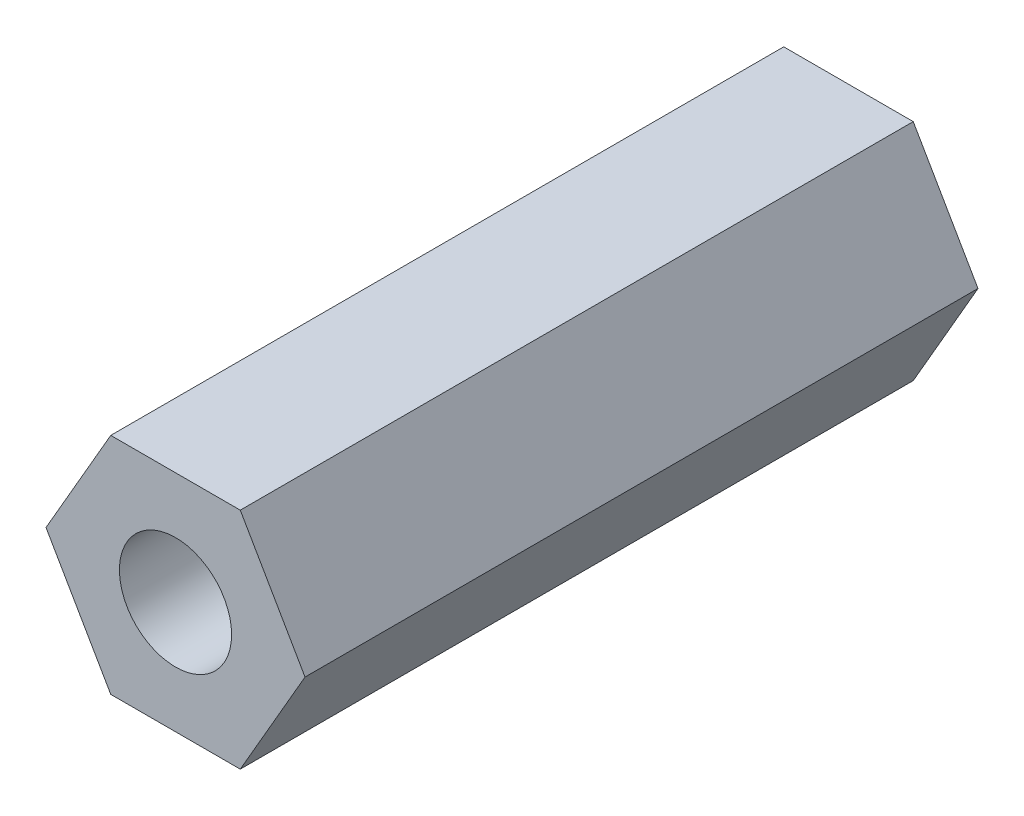
ISO-10303-21;
HEADER;
FILE_DESCRIPTION(('STEP AP214'),'2;1');
FILE_NAME('part.step','',(''),(''),'','','');
FILE_SCHEMA(('AUTOMOTIVE_DESIGN { 1 0 10303 214 1 1 1 1 }'));
ENDSEC;
DATA;
#1=APPLICATION_CONTEXT('core data for automotive mechanical design processes');
#2=APPLICATION_PROTOCOL_DEFINITION('international standard','automotive_design',2000,#1);
#3=PRODUCT_CONTEXT('',#1,'mechanical');
#4=PRODUCT('Part','Part','',(#3));
#5=PRODUCT_RELATED_PRODUCT_CATEGORY('part','',(#4));
#6=PRODUCT_DEFINITION_FORMATION('','',#4);
#7=PRODUCT_DEFINITION_CONTEXT('part definition',#1,'design');
#8=PRODUCT_DEFINITION('design','',#6,#7);
#9=PRODUCT_DEFINITION_SHAPE('','',#8);
#10=(LENGTH_UNIT() NAMED_UNIT(*) SI_UNIT(.MILLI.,.METRE.));
#11=(NAMED_UNIT(*) PLANE_ANGLE_UNIT() SI_UNIT($,.RADIAN.));
#12=(NAMED_UNIT(*) SI_UNIT($,.STERADIAN.) SOLID_ANGLE_UNIT());
#13=UNCERTAINTY_MEASURE_WITH_UNIT(LENGTH_MEASURE(1.E-05),#10,'distance_accuracy_value','');
#14=(GEOMETRIC_REPRESENTATION_CONTEXT(3) GLOBAL_UNCERTAINTY_ASSIGNED_CONTEXT((#13)) GLOBAL_UNIT_ASSIGNED_CONTEXT((#10,
#11,#12)) REPRESENTATION_CONTEXT('',''));
#15=CARTESIAN_POINT('',(0.,0.,0.));
#16=DIRECTION('',(0.,0.,1.));
#17=DIRECTION('',(1.,0.,0.));
#18=AXIS2_PLACEMENT_3D('',#15,#16,#17);
#19=CARTESIAN_POINT('',(-2.88675134594813,5.,45.2752523165195));
#20=DIRECTION('',(0.866025403784438,-0.5,0.));
#21=DIRECTION('',(0.5,0.866025403784438,0.));
#22=AXIS2_PLACEMENT_3D('',#19,#20,#21);
#23=PLANE('',#22);
#24=DIRECTION('',(-0.5,-0.866025403784438,0.));
#25=VECTOR('',#24,1.);
#26=CARTESIAN_POINT('',(-2.88675134594813,4.99999999999999,30.));
#27=LINE('',#26,#25);
#28=CARTESIAN_POINT('',(-2.88675134594813,5.,30.));
#29=VERTEX_POINT('',#28);
#30=CARTESIAN_POINT('',(-5.77350269189626,0.,30.));
#31=VERTEX_POINT('',#30);
#32=EDGE_CURVE('E113',#29,#31,#27,.T.);
#33=ORIENTED_EDGE('',*,*,#32,.F.);
#34=DIRECTION('',(0.,0.,-1.));
#35=VECTOR('',#34,1.);
#36=CARTESIAN_POINT('',(-2.88675134594813,5.,45.2752523165195));
#37=LINE('',#36,#35);
#38=CARTESIAN_POINT('',(-2.88675134594813,5.,0.));
#39=VERTEX_POINT('',#38);
#40=EDGE_CURVE('E36',#29,#39,#37,.T.);
#41=ORIENTED_EDGE('',*,*,#40,.T.);
#42=DIRECTION('',(-0.5,-0.866025403784438,0.));
#43=VECTOR('',#42,1.);
#44=CARTESIAN_POINT('',(-2.88675134594813,5.,0.));
#45=LINE('',#44,#43);
#46=CARTESIAN_POINT('',(-5.77350269189626,0.,0.));
#47=VERTEX_POINT('',#46);
#48=EDGE_CURVE('E121',#39,#47,#45,.T.);
#49=ORIENTED_EDGE('',*,*,#48,.T.);
#50=DIRECTION('',(0.,0.,-1.));
#51=VECTOR('',#50,1.);
#52=CARTESIAN_POINT('',(-5.77350269189626,0.,45.2752523165195));
#53=LINE('',#52,#51);
#54=EDGE_CURVE('E79',#31,#47,#53,.T.);
#55=ORIENTED_EDGE('',*,*,#54,.F.);
#56=EDGE_LOOP('',(#33,#41,#49,#55));
#57=FACE_BOUND('',#56,.T.);
#58=ADVANCED_FACE('F32',(#57),#23,.F.);
#59=CARTESIAN_POINT('',(-5.77350269189626,0.,45.2752523165195));
#60=DIRECTION('',(0.866025403784439,0.5,0.));
#61=DIRECTION('',(-0.5,0.866025403784439,0.));
#62=AXIS2_PLACEMENT_3D('',#59,#60,#61);
#63=PLANE('',#62);
#64=DIRECTION('',(0.5,-0.866025403784439,0.));
#65=VECTOR('',#64,1.);
#66=CARTESIAN_POINT('',(-5.77350269189626,0.,30.));
#67=LINE('',#66,#65);
#68=CARTESIAN_POINT('',(-2.88675134594813,-5.00000000000001,30.));
#69=VERTEX_POINT('',#68);
#70=EDGE_CURVE('E86',#31,#69,#67,.T.);
#71=ORIENTED_EDGE('',*,*,#70,.F.);
#72=ORIENTED_EDGE('',*,*,#54,.T.);
#73=DIRECTION('',(0.5,-0.866025403784439,0.));
#74=VECTOR('',#73,1.);
#75=CARTESIAN_POINT('',(-5.77350269189626,0.,0.));
#76=LINE('',#75,#74);
#77=CARTESIAN_POINT('',(-2.88675134594813,-5.00000000000001,0.));
#78=VERTEX_POINT('',#77);
#79=EDGE_CURVE('E120',#47,#78,#76,.T.);
#80=ORIENTED_EDGE('',*,*,#79,.T.);
#81=DIRECTION('',(0.,0.,-1.));
#82=VECTOR('',#81,1.);
#83=CARTESIAN_POINT('',(-2.88675134594813,-5.00000000000001,45.2752523165195));
#84=LINE('',#83,#82);
#85=EDGE_CURVE('E122',#69,#78,#84,.T.);
#86=ORIENTED_EDGE('',*,*,#85,.F.);
#87=EDGE_LOOP('',(#71,#72,#80,#86));
#88=FACE_BOUND('',#87,.T.);
#89=ADVANCED_FACE('F158',(#88),#63,.F.);
#90=CARTESIAN_POINT('',(-2.88675134594813,-5.00000000000001,45.2752523165195));
#91=DIRECTION('',(0.,1.,0.));
#92=DIRECTION('',(-1.,0.,0.));
#93=AXIS2_PLACEMENT_3D('',#90,#91,#92);
#94=PLANE('',#93);
#95=DIRECTION('',(1.,0.,0.));
#96=VECTOR('',#95,1.);
#97=CARTESIAN_POINT('',(-2.88675134594813,-5.00000000000001,30.));
#98=LINE('',#97,#96);
#99=CARTESIAN_POINT('',(2.88675134594813,-5.,30.));
#100=VERTEX_POINT('',#99);
#101=EDGE_CURVE('E107',#69,#100,#98,.T.);
#102=ORIENTED_EDGE('',*,*,#101,.F.);
#103=ORIENTED_EDGE('',*,*,#85,.T.);
#104=DIRECTION('',(1.,0.,0.));
#105=VECTOR('',#104,1.);
#106=CARTESIAN_POINT('',(-2.88675134594813,-5.00000000000001,0.));
#107=LINE('',#106,#105);
#108=CARTESIAN_POINT('',(2.88675134594813,-5.,0.));
#109=VERTEX_POINT('',#108);
#110=EDGE_CURVE('E124',#78,#109,#107,.T.);
#111=ORIENTED_EDGE('',*,*,#110,.T.);
#112=DIRECTION('',(0.,0.,-1.));
#113=VECTOR('',#112,1.);
#114=CARTESIAN_POINT('',(2.88675134594813,-5.,45.2752523165195));
#115=LINE('',#114,#113);
#116=EDGE_CURVE('E125',#100,#109,#115,.T.);
#117=ORIENTED_EDGE('',*,*,#116,.F.);
#118=EDGE_LOOP('',(#102,#103,#111,#117));
#119=FACE_BOUND('',#118,.T.);
#120=ADVANCED_FACE('F162',(#119),#94,.F.);
#121=CARTESIAN_POINT('',(2.88675134594813,-5.,45.2752523165195));
#122=DIRECTION('',(-0.866025403784439,0.5,0.));
#123=DIRECTION('',(-0.5,-0.866025403784439,0.));
#124=AXIS2_PLACEMENT_3D('',#121,#122,#123);
#125=PLANE('',#124);
#126=DIRECTION('',(0.5,0.866025403784439,0.));
#127=VECTOR('',#126,1.);
#128=CARTESIAN_POINT('',(2.88675134594813,-5.00000000000001,30.));
#129=LINE('',#128,#127);
#130=CARTESIAN_POINT('',(5.77350269189626,0.,30.));
#131=VERTEX_POINT('',#130);
#132=EDGE_CURVE('E41',#100,#131,#129,.T.);
#133=ORIENTED_EDGE('',*,*,#132,.F.);
#134=ORIENTED_EDGE('',*,*,#116,.T.);
#135=DIRECTION('',(0.5,0.866025403784439,0.));
#136=VECTOR('',#135,1.);
#137=CARTESIAN_POINT('',(2.88675134594813,-5.,0.));
#138=LINE('',#137,#136);
#139=CARTESIAN_POINT('',(5.77350269189626,0.,0.));
#140=VERTEX_POINT('',#139);
#141=EDGE_CURVE('E102',#109,#140,#138,.T.);
#142=ORIENTED_EDGE('',*,*,#141,.T.);
#143=DIRECTION('',(0.,0.,-1.));
#144=VECTOR('',#143,1.);
#145=CARTESIAN_POINT('',(5.77350269189626,0.,45.2752523165195));
#146=LINE('',#145,#144);
#147=EDGE_CURVE('E93',#131,#140,#146,.T.);
#148=ORIENTED_EDGE('',*,*,#147,.F.);
#149=EDGE_LOOP('',(#133,#134,#142,#148));
#150=FACE_BOUND('',#149,.T.);
#151=ADVANCED_FACE('F99',(#150),#125,.F.);
#152=CARTESIAN_POINT('',(5.77350269189626,0.,45.2752523165195));
#153=DIRECTION('',(-0.866025403784439,-0.5,0.));
#154=DIRECTION('',(0.5,-0.866025403784439,0.));
#155=AXIS2_PLACEMENT_3D('',#152,#153,#154);
#156=PLANE('',#155);
#157=DIRECTION('',(-0.5,0.866025403784439,0.));
#158=VECTOR('',#157,1.);
#159=CARTESIAN_POINT('',(5.77350269189626,0.,30.));
#160=LINE('',#159,#158);
#161=CARTESIAN_POINT('',(2.88675134594813,5.,30.));
#162=VERTEX_POINT('',#161);
#163=EDGE_CURVE('E11',#131,#162,#160,.T.);
#164=ORIENTED_EDGE('',*,*,#163,.F.);
#165=ORIENTED_EDGE('',*,*,#147,.T.);
#166=DIRECTION('',(-0.5,0.866025403784439,0.));
#167=VECTOR('',#166,1.);
#168=CARTESIAN_POINT('',(5.77350269189626,0.,0.));
#169=LINE('',#168,#167);
#170=CARTESIAN_POINT('',(2.88675134594813,5.,0.));
#171=VERTEX_POINT('',#170);
#172=EDGE_CURVE('E104',#140,#171,#169,.T.);
#173=ORIENTED_EDGE('',*,*,#172,.T.);
#174=DIRECTION('',(0.,0.,-1.));
#175=VECTOR('',#174,1.);
#176=CARTESIAN_POINT('',(2.88675134594813,5.,45.2752523165195));
#177=LINE('',#176,#175);
#178=EDGE_CURVE('E54',#162,#171,#177,.T.);
#179=ORIENTED_EDGE('',*,*,#178,.F.);
#180=EDGE_LOOP('',(#164,#165,#173,#179));
#181=FACE_BOUND('',#180,.T.);
#182=ADVANCED_FACE('F92',(#181),#156,.F.);
#183=CARTESIAN_POINT('',(2.88675134594813,5.,45.2752523165195));
#184=DIRECTION('',(0.,-1.,0.));
#185=DIRECTION('',(1.,0.,0.));
#186=AXIS2_PLACEMENT_3D('',#183,#184,#185);
#187=PLANE('',#186);
#188=DIRECTION('',(-1.,0.,0.));
#189=VECTOR('',#188,1.);
#190=CARTESIAN_POINT('',(2.88675134594813,5.,30.));
#191=LINE('',#190,#189);
#192=EDGE_CURVE('E116',#162,#29,#191,.T.);
#193=ORIENTED_EDGE('',*,*,#192,.F.);
#194=ORIENTED_EDGE('',*,*,#178,.T.);
#195=DIRECTION('',(-1.,0.,0.));
#196=VECTOR('',#195,1.);
#197=CARTESIAN_POINT('',(2.88675134594813,5.,0.));
#198=LINE('',#197,#196);
#199=EDGE_CURVE('E118',#171,#39,#198,.T.);
#200=ORIENTED_EDGE('',*,*,#199,.T.);
#201=ORIENTED_EDGE('',*,*,#40,.F.);
#202=EDGE_LOOP('',(#193,#194,#200,#201));
#203=FACE_BOUND('',#202,.T.);
#204=ADVANCED_FACE('F172',(#203),#187,.F.);
#205=CARTESIAN_POINT('',(0.,0.,0.));
#206=DIRECTION('',(0.,0.,1.));
#207=DIRECTION('',(1.,0.,0.));
#208=AXIS2_PLACEMENT_3D('',#205,#206,#207);
#209=PLANE('',#208);
#210=CARTESIAN_POINT('',(0.,0.,0.));
#211=DIRECTION('',(0.,0.,1.));
#212=DIRECTION('',(1.,0.,0.));
#213=AXIS2_PLACEMENT_3D('',#210,#211,#212);
#214=CIRCLE('',#213,2.5);
#215=CARTESIAN_POINT('',(2.5,0.,0.));
#216=VERTEX_POINT('',#215);
#217=EDGE_CURVE('E139',#216,#216,#214,.T.);
#218=ORIENTED_EDGE('',*,*,#217,.T.);
#219=EDGE_LOOP('',(#218));
#220=FACE_BOUND('',#219,.T.);
#221=ORIENTED_EDGE('',*,*,#48,.F.);
#222=ORIENTED_EDGE('',*,*,#199,.F.);
#223=ORIENTED_EDGE('',*,*,#172,.F.);
#224=ORIENTED_EDGE('',*,*,#141,.F.);
#225=ORIENTED_EDGE('',*,*,#110,.F.);
#226=ORIENTED_EDGE('',*,*,#79,.F.);
#227=EDGE_LOOP('',(#221,#222,#223,#224,#225,#226));
#228=FACE_BOUND('',#227,.T.);
#229=ADVANCED_FACE('F146',(#220,#228),#209,.F.);
#230=CARTESIAN_POINT('',(153.258048626584,27.5077986319806,30.));
#231=DIRECTION('',(0.,0.,1.));
#232=DIRECTION('',(0.,-1.,0.));
#233=AXIS2_PLACEMENT_3D('',#230,#231,#232);
#234=PLANE('',#233);
#235=CARTESIAN_POINT('',(0.,0.,30.));
#236=DIRECTION('',(0.,0.,1.));
#237=DIRECTION('',(1.,0.,0.));
#238=AXIS2_PLACEMENT_3D('',#235,#236,#237);
#239=CIRCLE('',#238,2.5);
#240=CARTESIAN_POINT('',(2.5,0.,30.));
#241=VERTEX_POINT('',#240);
#242=EDGE_CURVE('E137',#241,#241,#239,.T.);
#243=ORIENTED_EDGE('',*,*,#242,.F.);
#244=EDGE_LOOP('',(#243));
#245=FACE_BOUND('',#244,.T.);
#246=ORIENTED_EDGE('',*,*,#192,.T.);
#247=ORIENTED_EDGE('',*,*,#32,.T.);
#248=ORIENTED_EDGE('',*,*,#70,.T.);
#249=ORIENTED_EDGE('',*,*,#101,.T.);
#250=ORIENTED_EDGE('',*,*,#132,.T.);
#251=ORIENTED_EDGE('',*,*,#163,.T.);
#252=EDGE_LOOP('',(#246,#247,#248,#249,#250,#251));
#253=FACE_BOUND('',#252,.T.);
#254=ADVANCED_FACE('F34',(#245,#253),#234,.T.);
#255=CARTESIAN_POINT('',(0.,0.,9.99999999999999));
#256=DIRECTION('',(0.,0.,1.));
#257=DIRECTION('',(1.,0.,0.));
#258=AXIS2_PLACEMENT_3D('',#255,#256,#257);
#259=CYLINDRICAL_SURFACE('',#258,2.5);
#260=ORIENTED_EDGE('',*,*,#217,.F.);
#261=EDGE_LOOP('',(#260));
#262=FACE_BOUND('',#261,.T.);
#263=ORIENTED_EDGE('',*,*,#242,.T.);
#264=EDGE_LOOP('',(#263));
#265=FACE_BOUND('',#264,.T.);
#266=ADVANCED_FACE('F149',(#262,#265),#259,.F.);
#267=CLOSED_SHELL('',(#58,#89,#120,#151,#182,#204,#229,#254,#266));
#268=MANIFOLD_SOLID_BREP('B2',#267);
#269=ADVANCED_BREP_SHAPE_REPRESENTATION('',(#18,#268),#14);
#270=SHAPE_DEFINITION_REPRESENTATION(#9,#269);
ENDSEC;
END-ISO-10303-21;
